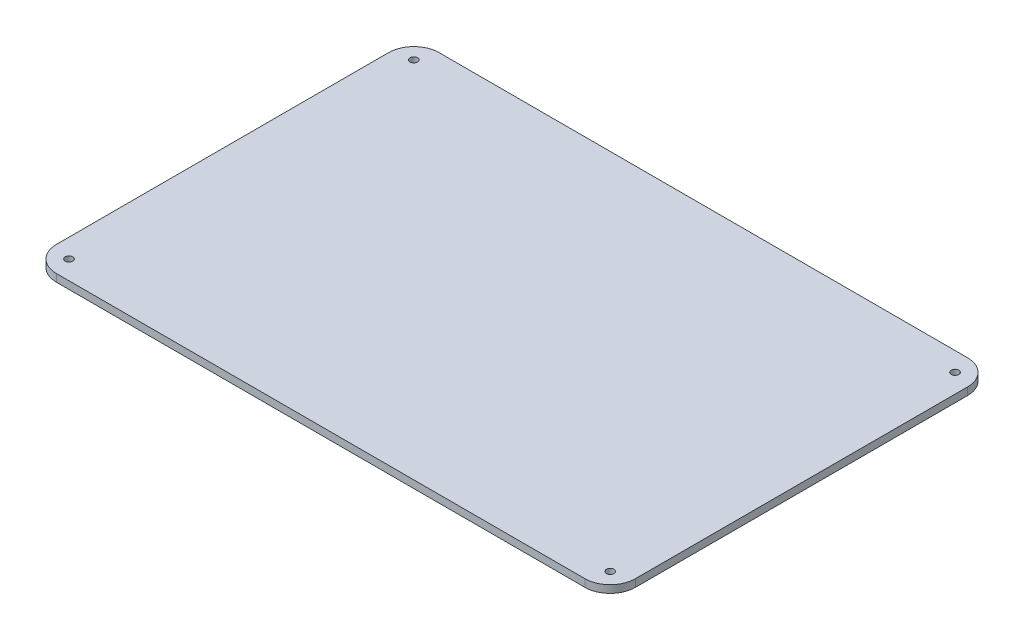
ISO-10303-21;
HEADER;
FILE_DESCRIPTION(('STEP AP214'),'2;1');
FILE_NAME('part.step','',(''),(''),'','','');
FILE_SCHEMA(('AUTOMOTIVE_DESIGN { 1 0 10303 214 1 1 1 1 }'));
ENDSEC;
DATA;
#1=APPLICATION_CONTEXT('core data for automotive mechanical design processes');
#2=APPLICATION_PROTOCOL_DEFINITION('international standard','automotive_design',2000,#1);
#3=PRODUCT_CONTEXT('',#1,'mechanical');
#4=PRODUCT('Part','Part','',(#3));
#5=PRODUCT_RELATED_PRODUCT_CATEGORY('part','',(#4));
#6=PRODUCT_DEFINITION_FORMATION('','',#4);
#7=PRODUCT_DEFINITION_CONTEXT('part definition',#1,'design');
#8=PRODUCT_DEFINITION('design','',#6,#7);
#9=PRODUCT_DEFINITION_SHAPE('','',#8);
#10=(LENGTH_UNIT() NAMED_UNIT(*) SI_UNIT(.MILLI.,.METRE.));
#11=(NAMED_UNIT(*) PLANE_ANGLE_UNIT() SI_UNIT($,.RADIAN.));
#12=(NAMED_UNIT(*) SI_UNIT($,.STERADIAN.) SOLID_ANGLE_UNIT());
#13=UNCERTAINTY_MEASURE_WITH_UNIT(LENGTH_MEASURE(1.E-05),#10,'distance_accuracy_value','');
#14=(GEOMETRIC_REPRESENTATION_CONTEXT(3) GLOBAL_UNCERTAINTY_ASSIGNED_CONTEXT((#13)) GLOBAL_UNIT_ASSIGNED_CONTEXT((#10,
#11,#12)) REPRESENTATION_CONTEXT('',''));
#15=CARTESIAN_POINT('',(0.,0.,0.));
#16=DIRECTION('',(0.,0.,1.));
#17=DIRECTION('',(1.,0.,0.));
#18=AXIS2_PLACEMENT_3D('',#15,#16,#17);
#19=CARTESIAN_POINT('',(-153.903225806452,3.,-45.5));
#20=DIRECTION('',(1.,0.,0.));
#21=DIRECTION('',(0.,0.,-1.));
#22=AXIS2_PLACEMENT_3D('',#19,#20,#21);
#23=PLANE('',#22);
#24=DIRECTION('',(0.,0.,1.));
#25=VECTOR('',#24,1.);
#26=CARTESIAN_POINT('',(-153.903225806452,0.,-45.5));
#27=LINE('',#26,#25);
#28=CARTESIAN_POINT('',(-153.903225806452,0.,-35.5));
#29=VERTEX_POINT('',#28);
#30=CARTESIAN_POINT('',(-153.903225806452,0.,96.5));
#31=VERTEX_POINT('',#30);
#32=EDGE_CURVE('E140',#29,#31,#27,.T.);
#33=ORIENTED_EDGE('',*,*,#32,.T.);
#34=DIRECTION('',(0.,-1.,0.));
#35=VECTOR('',#34,1.);
#36=CARTESIAN_POINT('',(-153.903225806452,3.,96.5));
#37=LINE('',#36,#35);
#38=CARTESIAN_POINT('',(-153.903225806452,3.,96.5));
#39=VERTEX_POINT('',#38);
#40=EDGE_CURVE('E157',#31,#39,#37,.F.);
#41=ORIENTED_EDGE('',*,*,#40,.T.);
#42=DIRECTION('',(0.,0.,1.));
#43=VECTOR('',#42,1.);
#44=CARTESIAN_POINT('',(-153.903225806452,3.,-45.5));
#45=LINE('',#44,#43);
#46=CARTESIAN_POINT('',(-153.903225806452,3.,-35.5));
#47=VERTEX_POINT('',#46);
#48=EDGE_CURVE('E139',#47,#39,#45,.T.);
#49=ORIENTED_EDGE('',*,*,#48,.F.);
#50=DIRECTION('',(0.,-1.,0.));
#51=VECTOR('',#50,1.);
#52=CARTESIAN_POINT('',(-153.903225806452,3.,-35.5));
#53=LINE('',#52,#51);
#54=EDGE_CURVE('E156',#47,#29,#53,.T.);
#55=ORIENTED_EDGE('',*,*,#54,.T.);
#56=EDGE_LOOP('',(#33,#41,#49,#55));
#57=FACE_BOUND('',#56,.T.);
#58=ADVANCED_FACE('F41',(#57),#23,.F.);
#59=CARTESIAN_POINT('',(-153.903225806452,3.,106.5));
#60=DIRECTION('',(0.,0.,-1.));
#61=DIRECTION('',(-1.,0.,0.));
#62=AXIS2_PLACEMENT_3D('',#59,#60,#61);
#63=PLANE('',#62);
#64=DIRECTION('',(1.,0.,0.));
#65=VECTOR('',#64,1.);
#66=CARTESIAN_POINT('',(-153.903225806452,0.,106.5));
#67=LINE('',#66,#65);
#68=CARTESIAN_POINT('',(-143.903225806452,0.,106.5));
#69=VERTEX_POINT('',#68);
#70=CARTESIAN_POINT('',(66.0967741935484,0.,106.5));
#71=VERTEX_POINT('',#70);
#72=EDGE_CURVE('E131',#69,#71,#67,.T.);
#73=ORIENTED_EDGE('',*,*,#72,.T.);
#74=DIRECTION('',(0.,-1.,0.));
#75=VECTOR('',#74,1.);
#76=CARTESIAN_POINT('',(66.0967741935484,3.,106.5));
#77=LINE('',#76,#75);
#78=CARTESIAN_POINT('',(66.0967741935484,3.,106.5));
#79=VERTEX_POINT('',#78);
#80=EDGE_CURVE('E115',#71,#79,#77,.F.);
#81=ORIENTED_EDGE('',*,*,#80,.T.);
#82=DIRECTION('',(1.,0.,0.));
#83=VECTOR('',#82,1.);
#84=CARTESIAN_POINT('',(-153.903225806452,3.,106.5));
#85=LINE('',#84,#83);
#86=CARTESIAN_POINT('',(-143.903225806452,3.,106.5));
#87=VERTEX_POINT('',#86);
#88=EDGE_CURVE('E172',#87,#79,#85,.T.);
#89=ORIENTED_EDGE('',*,*,#88,.F.);
#90=DIRECTION('',(0.,-1.,0.));
#91=VECTOR('',#90,1.);
#92=CARTESIAN_POINT('',(-143.903225806452,3.,106.5));
#93=LINE('',#92,#91);
#94=EDGE_CURVE('E120',#87,#69,#93,.T.);
#95=ORIENTED_EDGE('',*,*,#94,.T.);
#96=EDGE_LOOP('',(#73,#81,#89,#95));
#97=FACE_BOUND('',#96,.T.);
#98=ADVANCED_FACE('F177',(#97),#63,.F.);
#99=CARTESIAN_POINT('',(76.0967741935484,3.,-45.5));
#100=DIRECTION('',(-1.,0.,0.));
#101=DIRECTION('',(0.,0.,1.));
#102=AXIS2_PLACEMENT_3D('',#99,#100,#101);
#103=PLANE('',#102);
#104=DIRECTION('',(0.,0.,-1.));
#105=VECTOR('',#104,1.);
#106=CARTESIAN_POINT('',(76.0967741935484,3.,-45.5));
#107=LINE('',#106,#105);
#108=CARTESIAN_POINT('',(76.0967741935484,3.,96.5));
#109=VERTEX_POINT('',#108);
#110=CARTESIAN_POINT('',(76.0967741935484,3.,-35.5));
#111=VERTEX_POINT('',#110);
#112=EDGE_CURVE('E127',#109,#111,#107,.T.);
#113=ORIENTED_EDGE('',*,*,#112,.F.);
#114=DIRECTION('',(0.,-1.,0.));
#115=VECTOR('',#114,1.);
#116=CARTESIAN_POINT('',(76.0967741935484,3.,96.5));
#117=LINE('',#116,#115);
#118=CARTESIAN_POINT('',(76.0967741935484,0.,96.5));
#119=VERTEX_POINT('',#118);
#120=EDGE_CURVE('E111',#109,#119,#117,.T.);
#121=ORIENTED_EDGE('',*,*,#120,.T.);
#122=DIRECTION('',(0.,0.,-1.));
#123=VECTOR('',#122,1.);
#124=CARTESIAN_POINT('',(76.0967741935484,0.,-45.5));
#125=LINE('',#124,#123);
#126=CARTESIAN_POINT('',(76.0967741935484,0.,-35.5));
#127=VERTEX_POINT('',#126);
#128=EDGE_CURVE('E121',#119,#127,#125,.T.);
#129=ORIENTED_EDGE('',*,*,#128,.T.);
#130=DIRECTION('',(0.,-1.,0.));
#131=VECTOR('',#130,1.);
#132=CARTESIAN_POINT('',(76.0967741935484,3.,-35.5));
#133=LINE('',#132,#131);
#134=EDGE_CURVE('E129',#127,#111,#133,.F.);
#135=ORIENTED_EDGE('',*,*,#134,.T.);
#136=EDGE_LOOP('',(#113,#121,#129,#135));
#137=FACE_BOUND('',#136,.T.);
#138=ADVANCED_FACE('F124',(#137),#103,.F.);
#139=CARTESIAN_POINT('',(-153.903225806452,3.,-45.5));
#140=DIRECTION('',(0.,0.,1.));
#141=DIRECTION('',(1.,0.,0.));
#142=AXIS2_PLACEMENT_3D('',#139,#140,#141);
#143=PLANE('',#142);
#144=DIRECTION('',(-1.,0.,0.));
#145=VECTOR('',#144,1.);
#146=CARTESIAN_POINT('',(-153.903225806452,3.,-45.5));
#147=LINE('',#146,#145);
#148=CARTESIAN_POINT('',(66.0967741935484,3.,-45.5));
#149=VERTEX_POINT('',#148);
#150=CARTESIAN_POINT('',(-143.903225806452,3.,-45.5));
#151=VERTEX_POINT('',#150);
#152=EDGE_CURVE('E145',#149,#151,#147,.T.);
#153=ORIENTED_EDGE('',*,*,#152,.F.);
#154=DIRECTION('',(0.,-1.,0.));
#155=VECTOR('',#154,1.);
#156=CARTESIAN_POINT('',(66.0967741935484,3.,-45.5));
#157=LINE('',#156,#155);
#158=CARTESIAN_POINT('',(66.0967741935484,0.,-45.5));
#159=VERTEX_POINT('',#158);
#160=EDGE_CURVE('E11',#149,#159,#157,.T.);
#161=ORIENTED_EDGE('',*,*,#160,.T.);
#162=DIRECTION('',(-1.,0.,0.));
#163=VECTOR('',#162,1.);
#164=CARTESIAN_POINT('',(-153.903225806452,0.,-45.5));
#165=LINE('',#164,#163);
#166=CARTESIAN_POINT('',(-143.903225806452,0.,-45.5));
#167=VERTEX_POINT('',#166);
#168=EDGE_CURVE('E135',#159,#167,#165,.T.);
#169=ORIENTED_EDGE('',*,*,#168,.T.);
#170=DIRECTION('',(0.,-1.,0.));
#171=VECTOR('',#170,1.);
#172=CARTESIAN_POINT('',(-143.903225806452,3.,-45.5));
#173=LINE('',#172,#171);
#174=EDGE_CURVE('E47',#167,#151,#173,.F.);
#175=ORIENTED_EDGE('',*,*,#174,.T.);
#176=EDGE_LOOP('',(#153,#161,#169,#175));
#177=FACE_BOUND('',#176,.T.);
#178=ADVANCED_FACE('F214',(#177),#143,.F.);
#179=CARTESIAN_POINT('',(0.,3.,0.));
#180=DIRECTION('',(0.,1.,0.));
#181=DIRECTION('',(0.,0.,1.));
#182=AXIS2_PLACEMENT_3D('',#179,#180,#181);
#183=PLANE('',#182);
#184=CARTESIAN_POINT('',(-146.403225806452,3.,99.));
#185=DIRECTION('',(0.,1.,0.));
#186=DIRECTION('',(0.,0.,1.));
#187=AXIS2_PLACEMENT_3D('',#184,#185,#186);
#188=CIRCLE('',#187,1.5);
#189=CARTESIAN_POINT('',(-146.403225806452,3.,100.5));
#190=VERTEX_POINT('',#189);
#191=EDGE_CURVE('E191',#190,#190,#188,.T.);
#192=ORIENTED_EDGE('',*,*,#191,.F.);
#193=EDGE_LOOP('',(#192));
#194=FACE_BOUND('',#193,.T.);
#195=CARTESIAN_POINT('',(68.5967741935484,3.,99.));
#196=DIRECTION('',(0.,1.,0.));
#197=DIRECTION('',(0.,0.,1.));
#198=AXIS2_PLACEMENT_3D('',#195,#196,#197);
#199=CIRCLE('',#198,1.5);
#200=CARTESIAN_POINT('',(68.5967741935484,3.,100.5));
#201=VERTEX_POINT('',#200);
#202=EDGE_CURVE('E198',#201,#201,#199,.T.);
#203=ORIENTED_EDGE('',*,*,#202,.F.);
#204=EDGE_LOOP('',(#203));
#205=FACE_BOUND('',#204,.T.);
#206=CARTESIAN_POINT('',(68.5967741935484,3.,-38.));
#207=DIRECTION('',(0.,1.,0.));
#208=DIRECTION('',(0.,0.,1.));
#209=AXIS2_PLACEMENT_3D('',#206,#207,#208);
#210=CIRCLE('',#209,1.5);
#211=CARTESIAN_POINT('',(68.5967741935484,3.,-36.5));
#212=VERTEX_POINT('',#211);
#213=EDGE_CURVE('E186',#212,#212,#210,.T.);
#214=ORIENTED_EDGE('',*,*,#213,.F.);
#215=EDGE_LOOP('',(#214));
#216=FACE_BOUND('',#215,.T.);
#217=CARTESIAN_POINT('',(-146.403225806452,3.,-38.));
#218=DIRECTION('',(0.,1.,0.));
#219=DIRECTION('',(0.,0.,1.));
#220=AXIS2_PLACEMENT_3D('',#217,#218,#219);
#221=CIRCLE('',#220,1.5);
#222=CARTESIAN_POINT('',(-146.403225806452,3.,-36.5));
#223=VERTEX_POINT('',#222);
#224=EDGE_CURVE('E185',#223,#223,#221,.T.);
#225=ORIENTED_EDGE('',*,*,#224,.F.);
#226=EDGE_LOOP('',(#225));
#227=FACE_BOUND('',#226,.T.);
#228=ORIENTED_EDGE('',*,*,#88,.T.);
#229=CARTESIAN_POINT('',(66.0967741935484,3.,96.5));
#230=DIRECTION('',(0.,1.,0.));
#231=DIRECTION('',(0.,0.,1.));
#232=AXIS2_PLACEMENT_3D('',#229,#230,#231);
#233=CIRCLE('',#232,10.);
#234=EDGE_CURVE('E153',#79,#109,#233,.T.);
#235=ORIENTED_EDGE('',*,*,#234,.T.);
#236=ORIENTED_EDGE('',*,*,#112,.T.);
#237=CARTESIAN_POINT('',(66.0967741935484,3.,-35.5));
#238=DIRECTION('',(0.,1.,0.));
#239=DIRECTION('',(0.,0.,1.));
#240=AXIS2_PLACEMENT_3D('',#237,#238,#239);
#241=CIRCLE('',#240,10.);
#242=EDGE_CURVE('E65',#111,#149,#241,.T.);
#243=ORIENTED_EDGE('',*,*,#242,.T.);
#244=ORIENTED_EDGE('',*,*,#152,.T.);
#245=CARTESIAN_POINT('',(-143.903225806452,3.,-35.5));
#246=DIRECTION('',(0.,1.,0.));
#247=DIRECTION('',(0.,0.,1.));
#248=AXIS2_PLACEMENT_3D('',#245,#246,#247);
#249=CIRCLE('',#248,10.);
#250=EDGE_CURVE('E148',#151,#47,#249,.T.);
#251=ORIENTED_EDGE('',*,*,#250,.T.);
#252=ORIENTED_EDGE('',*,*,#48,.T.);
#253=CARTESIAN_POINT('',(-143.903225806452,3.,96.5));
#254=DIRECTION('',(0.,1.,0.));
#255=DIRECTION('',(0.,0.,1.));
#256=AXIS2_PLACEMENT_3D('',#253,#254,#255);
#257=CIRCLE('',#256,10.);
#258=EDGE_CURVE('E155',#39,#87,#257,.T.);
#259=ORIENTED_EDGE('',*,*,#258,.T.);
#260=EDGE_LOOP('',(#228,#235,#236,#243,#244,#251,#252,#259));
#261=FACE_BOUND('',#260,.T.);
#262=ADVANCED_FACE('F171',(#194,#205,#216,#227,#261),#183,.T.);
#263=CARTESIAN_POINT('',(0.,0.,0.));
#264=DIRECTION('',(0.,1.,0.));
#265=DIRECTION('',(0.,0.,1.));
#266=AXIS2_PLACEMENT_3D('',#263,#264,#265);
#267=PLANE('',#266);
#268=CARTESIAN_POINT('',(-146.403225806452,0.,99.));
#269=DIRECTION('',(0.,1.,0.));
#270=DIRECTION('',(0.,0.,1.));
#271=AXIS2_PLACEMENT_3D('',#268,#269,#270);
#272=CIRCLE('',#271,1.5);
#273=CARTESIAN_POINT('',(-146.403225806452,0.,100.5));
#274=VERTEX_POINT('',#273);
#275=EDGE_CURVE('E192',#274,#274,#272,.T.);
#276=ORIENTED_EDGE('',*,*,#275,.T.);
#277=EDGE_LOOP('',(#276));
#278=FACE_BOUND('',#277,.T.);
#279=CARTESIAN_POINT('',(68.5967741935484,0.,99.));
#280=DIRECTION('',(0.,1.,0.));
#281=DIRECTION('',(0.,0.,1.));
#282=AXIS2_PLACEMENT_3D('',#279,#280,#281);
#283=CIRCLE('',#282,1.5);
#284=CARTESIAN_POINT('',(68.5967741935484,0.,100.5));
#285=VERTEX_POINT('',#284);
#286=EDGE_CURVE('E199',#285,#285,#283,.T.);
#287=ORIENTED_EDGE('',*,*,#286,.T.);
#288=EDGE_LOOP('',(#287));
#289=FACE_BOUND('',#288,.T.);
#290=CARTESIAN_POINT('',(68.5967741935484,0.,-38.));
#291=DIRECTION('',(0.,1.,0.));
#292=DIRECTION('',(0.,0.,1.));
#293=AXIS2_PLACEMENT_3D('',#290,#291,#292);
#294=CIRCLE('',#293,1.5);
#295=CARTESIAN_POINT('',(68.5967741935484,0.,-36.5));
#296=VERTEX_POINT('',#295);
#297=EDGE_CURVE('E205',#296,#296,#294,.T.);
#298=ORIENTED_EDGE('',*,*,#297,.T.);
#299=EDGE_LOOP('',(#298));
#300=FACE_BOUND('',#299,.T.);
#301=CARTESIAN_POINT('',(-146.403225806452,0.,-38.));
#302=DIRECTION('',(0.,1.,0.));
#303=DIRECTION('',(0.,0.,1.));
#304=AXIS2_PLACEMENT_3D('',#301,#302,#303);
#305=CIRCLE('',#304,1.5);
#306=CARTESIAN_POINT('',(-146.403225806452,0.,-36.5));
#307=VERTEX_POINT('',#306);
#308=EDGE_CURVE('E179',#307,#307,#305,.T.);
#309=ORIENTED_EDGE('',*,*,#308,.T.);
#310=EDGE_LOOP('',(#309));
#311=FACE_BOUND('',#310,.T.);
#312=ORIENTED_EDGE('',*,*,#128,.F.);
#313=CARTESIAN_POINT('',(66.0967741935484,0.,96.5));
#314=DIRECTION('',(0.,1.,0.));
#315=DIRECTION('',(0.,0.,1.));
#316=AXIS2_PLACEMENT_3D('',#313,#314,#315);
#317=CIRCLE('',#316,10.);
#318=EDGE_CURVE('E110',#119,#71,#317,.F.);
#319=ORIENTED_EDGE('',*,*,#318,.T.);
#320=ORIENTED_EDGE('',*,*,#72,.F.);
#321=CARTESIAN_POINT('',(-143.903225806452,0.,96.5));
#322=DIRECTION('',(0.,1.,0.));
#323=DIRECTION('',(0.,0.,1.));
#324=AXIS2_PLACEMENT_3D('',#321,#322,#323);
#325=CIRCLE('',#324,10.);
#326=EDGE_CURVE('E117',#69,#31,#325,.F.);
#327=ORIENTED_EDGE('',*,*,#326,.T.);
#328=ORIENTED_EDGE('',*,*,#32,.F.);
#329=CARTESIAN_POINT('',(-143.903225806452,0.,-35.5));
#330=DIRECTION('',(0.,1.,0.));
#331=DIRECTION('',(0.,0.,1.));
#332=AXIS2_PLACEMENT_3D('',#329,#330,#331);
#333=CIRCLE('',#332,10.);
#334=EDGE_CURVE('E130',#29,#167,#333,.F.);
#335=ORIENTED_EDGE('',*,*,#334,.T.);
#336=ORIENTED_EDGE('',*,*,#168,.F.);
#337=CARTESIAN_POINT('',(66.0967741935484,0.,-35.5));
#338=DIRECTION('',(0.,1.,0.));
#339=DIRECTION('',(0.,0.,1.));
#340=AXIS2_PLACEMENT_3D('',#337,#338,#339);
#341=CIRCLE('',#340,10.);
#342=EDGE_CURVE('E134',#159,#127,#341,.F.);
#343=ORIENTED_EDGE('',*,*,#342,.T.);
#344=EDGE_LOOP('',(#312,#319,#320,#327,#328,#335,#336,#343));
#345=FACE_BOUND('',#344,.T.);
#346=ADVANCED_FACE('F128',(#278,#289,#300,#311,#345),#267,.F.);
#347=CARTESIAN_POINT('',(-146.403225806452,0.,-38.));
#348=DIRECTION('',(0.,1.,0.));
#349=DIRECTION('',(0.,0.,1.));
#350=AXIS2_PLACEMENT_3D('',#347,#348,#349);
#351=CYLINDRICAL_SURFACE('',#350,1.5);
#352=ORIENTED_EDGE('',*,*,#308,.F.);
#353=EDGE_LOOP('',(#352));
#354=FACE_BOUND('',#353,.T.);
#355=ORIENTED_EDGE('',*,*,#224,.T.);
#356=EDGE_LOOP('',(#355));
#357=FACE_BOUND('',#356,.T.);
#358=ADVANCED_FACE('F220',(#354,#357),#351,.F.);
#359=CARTESIAN_POINT('',(68.5967741935484,0.,-38.));
#360=DIRECTION('',(0.,1.,0.));
#361=DIRECTION('',(0.,0.,1.));
#362=AXIS2_PLACEMENT_3D('',#359,#360,#361);
#363=CYLINDRICAL_SURFACE('',#362,1.5);
#364=ORIENTED_EDGE('',*,*,#297,.F.);
#365=EDGE_LOOP('',(#364));
#366=FACE_BOUND('',#365,.T.);
#367=ORIENTED_EDGE('',*,*,#213,.T.);
#368=EDGE_LOOP('',(#367));
#369=FACE_BOUND('',#368,.T.);
#370=ADVANCED_FACE('F209',(#366,#369),#363,.F.);
#371=CARTESIAN_POINT('',(68.5967741935484,0.,99.));
#372=DIRECTION('',(0.,1.,0.));
#373=DIRECTION('',(0.,0.,1.));
#374=AXIS2_PLACEMENT_3D('',#371,#372,#373);
#375=CYLINDRICAL_SURFACE('',#374,1.5);
#376=ORIENTED_EDGE('',*,*,#286,.F.);
#377=EDGE_LOOP('',(#376));
#378=FACE_BOUND('',#377,.T.);
#379=ORIENTED_EDGE('',*,*,#202,.T.);
#380=EDGE_LOOP('',(#379));
#381=FACE_BOUND('',#380,.T.);
#382=ADVANCED_FACE('F222',(#378,#381),#375,.F.);
#383=CARTESIAN_POINT('',(-146.403225806452,0.,99.));
#384=DIRECTION('',(0.,1.,0.));
#385=DIRECTION('',(0.,0.,1.));
#386=AXIS2_PLACEMENT_3D('',#383,#384,#385);
#387=CYLINDRICAL_SURFACE('',#386,1.5);
#388=ORIENTED_EDGE('',*,*,#275,.F.);
#389=EDGE_LOOP('',(#388));
#390=FACE_BOUND('',#389,.T.);
#391=ORIENTED_EDGE('',*,*,#191,.T.);
#392=EDGE_LOOP('',(#391));
#393=FACE_BOUND('',#392,.T.);
#394=ADVANCED_FACE('F242',(#390,#393),#387,.F.);
#395=CARTESIAN_POINT('',(66.0967741935484,3.,96.5));
#396=DIRECTION('',(0.,-1.,0.));
#397=DIRECTION('',(0.,0.,-1.));
#398=AXIS2_PLACEMENT_3D('',#395,#396,#397);
#399=CYLINDRICAL_SURFACE('',#398,10.);
#400=ORIENTED_EDGE('',*,*,#234,.F.);
#401=ORIENTED_EDGE('',*,*,#80,.F.);
#402=ORIENTED_EDGE('',*,*,#318,.F.);
#403=ORIENTED_EDGE('',*,*,#120,.F.);
#404=EDGE_LOOP('',(#400,#401,#402,#403));
#405=FACE_BOUND('',#404,.T.);
#406=ADVANCED_FACE('F109',(#405),#399,.T.);
#407=CARTESIAN_POINT('',(-143.903225806452,3.,96.5));
#408=DIRECTION('',(0.,-1.,0.));
#409=DIRECTION('',(0.,0.,-1.));
#410=AXIS2_PLACEMENT_3D('',#407,#408,#409);
#411=CYLINDRICAL_SURFACE('',#410,10.);
#412=ORIENTED_EDGE('',*,*,#258,.F.);
#413=ORIENTED_EDGE('',*,*,#40,.F.);
#414=ORIENTED_EDGE('',*,*,#326,.F.);
#415=ORIENTED_EDGE('',*,*,#94,.F.);
#416=EDGE_LOOP('',(#412,#413,#414,#415));
#417=FACE_BOUND('',#416,.T.);
#418=ADVANCED_FACE('F180',(#417),#411,.T.);
#419=CARTESIAN_POINT('',(66.0967741935484,3.,-35.5));
#420=DIRECTION('',(0.,-1.,0.));
#421=DIRECTION('',(0.,0.,-1.));
#422=AXIS2_PLACEMENT_3D('',#419,#420,#421);
#423=CYLINDRICAL_SURFACE('',#422,10.);
#424=ORIENTED_EDGE('',*,*,#242,.F.);
#425=ORIENTED_EDGE('',*,*,#134,.F.);
#426=ORIENTED_EDGE('',*,*,#342,.F.);
#427=ORIENTED_EDGE('',*,*,#160,.F.);
#428=EDGE_LOOP('',(#424,#425,#426,#427));
#429=FACE_BOUND('',#428,.T.);
#430=ADVANCED_FACE('F246',(#429),#423,.T.);
#431=CARTESIAN_POINT('',(-143.903225806452,3.,-35.5));
#432=DIRECTION('',(0.,-1.,0.));
#433=DIRECTION('',(0.,0.,-1.));
#434=AXIS2_PLACEMENT_3D('',#431,#432,#433);
#435=CYLINDRICAL_SURFACE('',#434,10.);
#436=ORIENTED_EDGE('',*,*,#250,.F.);
#437=ORIENTED_EDGE('',*,*,#174,.F.);
#438=ORIENTED_EDGE('',*,*,#334,.F.);
#439=ORIENTED_EDGE('',*,*,#54,.F.);
#440=EDGE_LOOP('',(#436,#437,#438,#439));
#441=FACE_BOUND('',#440,.T.);
#442=ADVANCED_FACE('F43',(#441),#435,.T.);
#443=CLOSED_SHELL('',(#58,#98,#138,#178,#262,#346,#358,#370,#382,#394,#406,#418,#430,#442));
#444=MANIFOLD_SOLID_BREP('B2',#443);
#445=ADVANCED_BREP_SHAPE_REPRESENTATION('',(#18,#444),#14);
#446=SHAPE_DEFINITION_REPRESENTATION(#9,#445);
ENDSEC;
END-ISO-10303-21;
